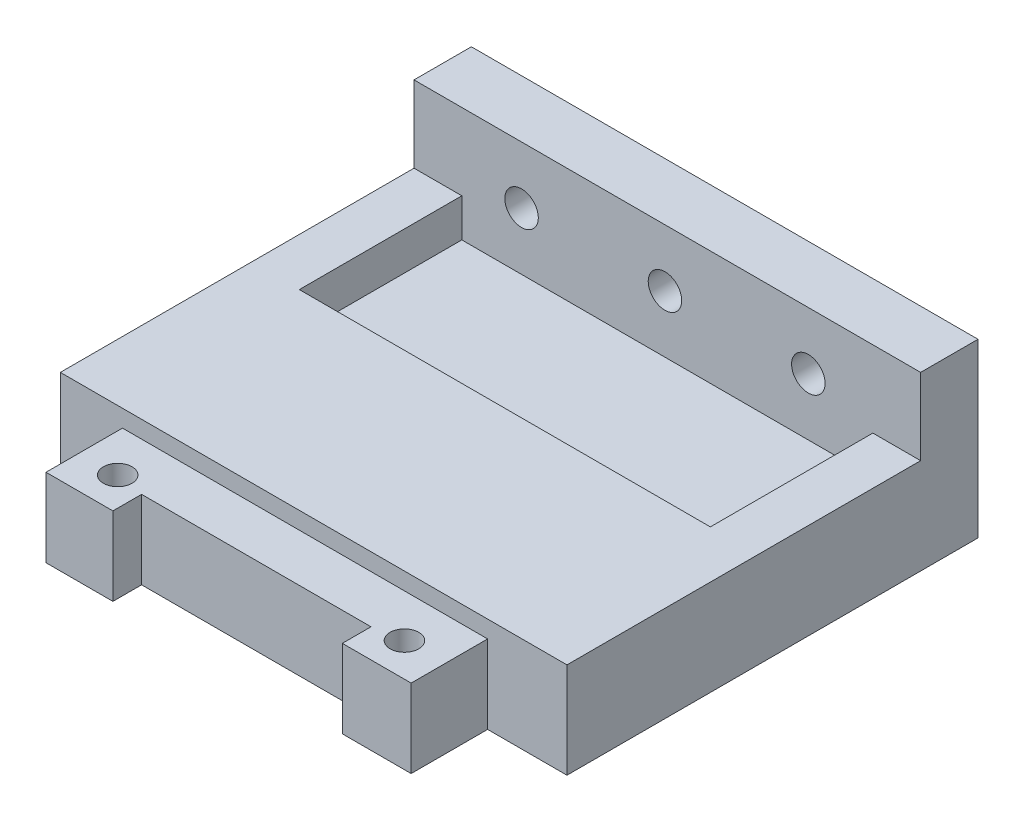
ISO-10303-21;
HEADER;
FILE_DESCRIPTION(('STEP AP214'),'2;1');
FILE_NAME('part.step','',(''),(''),'','','');
FILE_SCHEMA(('AUTOMOTIVE_DESIGN { 1 0 10303 214 1 1 1 1 }'));
ENDSEC;
DATA;
#1=APPLICATION_CONTEXT('core data for automotive mechanical design processes');
#2=APPLICATION_PROTOCOL_DEFINITION('international standard','automotive_design',2000,#1);
#3=PRODUCT_CONTEXT('',#1,'mechanical');
#4=PRODUCT('Part','Part','',(#3));
#5=PRODUCT_RELATED_PRODUCT_CATEGORY('part','',(#4));
#6=PRODUCT_DEFINITION_FORMATION('','',#4);
#7=PRODUCT_DEFINITION_CONTEXT('part definition',#1,'design');
#8=PRODUCT_DEFINITION('design','',#6,#7);
#9=PRODUCT_DEFINITION_SHAPE('','',#8);
#10=(LENGTH_UNIT() NAMED_UNIT(*) SI_UNIT(.MILLI.,.METRE.));
#11=(NAMED_UNIT(*) PLANE_ANGLE_UNIT() SI_UNIT($,.RADIAN.));
#12=(NAMED_UNIT(*) SI_UNIT($,.STERADIAN.) SOLID_ANGLE_UNIT());
#13=UNCERTAINTY_MEASURE_WITH_UNIT(LENGTH_MEASURE(1.E-05),#10,'distance_accuracy_value','');
#14=(GEOMETRIC_REPRESENTATION_CONTEXT(3) GLOBAL_UNCERTAINTY_ASSIGNED_CONTEXT((#13)) GLOBAL_UNIT_ASSIGNED_CONTEXT((#10,
#11,#12)) REPRESENTATION_CONTEXT('',''));
#15=CARTESIAN_POINT('',(0.,0.,0.));
#16=DIRECTION('',(0.,0.,1.));
#17=DIRECTION('',(1.,0.,0.));
#18=AXIS2_PLACEMENT_3D('',#15,#16,#17);
#19=CARTESIAN_POINT('',(0.,10.,0.));
#20=DIRECTION('',(0.,-1.,0.));
#21=DIRECTION('',(0.,0.,-1.));
#22=AXIS2_PLACEMENT_3D('',#19,#20,#21);
#23=PLANE('',#22);
#24=DIRECTION('',(1.,0.,0.));
#25=VECTOR('',#24,1.);
#26=CARTESIAN_POINT('',(5.,10.,-20.));
#27=LINE('',#26,#25);
#28=CARTESIAN_POINT('',(5.,10.,-20.));
#29=VERTEX_POINT('',#28);
#30=CARTESIAN_POINT('',(48.,10.,-20.));
#31=VERTEX_POINT('',#30);
#32=EDGE_CURVE('E186',#29,#31,#27,.T.);
#33=ORIENTED_EDGE('',*,*,#32,.F.);
#34=DIRECTION('',(0.,0.,1.));
#35=VECTOR('',#34,1.);
#36=CARTESIAN_POINT('',(5.,10.,-37.));
#37=LINE('',#36,#35);
#38=CARTESIAN_POINT('',(5.,10.,-37.));
#39=VERTEX_POINT('',#38);
#40=EDGE_CURVE('E168',#39,#29,#37,.T.);
#41=ORIENTED_EDGE('',*,*,#40,.F.);
#42=DIRECTION('',(1.,0.,0.));
#43=VECTOR('',#42,1.);
#44=CARTESIAN_POINT('',(0.,10.,-37.));
#45=LINE('',#44,#43);
#46=CARTESIAN_POINT('',(0.,10.,-37.));
#47=VERTEX_POINT('',#46);
#48=EDGE_CURVE('E59',#47,#39,#45,.T.);
#49=ORIENTED_EDGE('',*,*,#48,.F.);
#50=DIRECTION('',(0.,0.,1.));
#51=VECTOR('',#50,1.);
#52=CARTESIAN_POINT('',(0.,10.,0.));
#53=LINE('',#52,#51);
#54=CARTESIAN_POINT('',(0.,10.,0.));
#55=VERTEX_POINT('',#54);
#56=EDGE_CURVE('E333',#47,#55,#53,.T.);
#57=ORIENTED_EDGE('',*,*,#56,.T.);
#58=DIRECTION('',(1.,0.,0.));
#59=VECTOR('',#58,1.);
#60=CARTESIAN_POINT('',(0.,10.,0.));
#61=LINE('',#60,#59);
#62=CARTESIAN_POINT('',(53.,10.,0.));
#63=VERTEX_POINT('',#62);
#64=EDGE_CURVE('E332',#55,#63,#61,.T.);
#65=ORIENTED_EDGE('',*,*,#64,.T.);
#66=DIRECTION('',(0.,0.,-1.));
#67=VECTOR('',#66,1.);
#68=CARTESIAN_POINT('',(53.,10.,0.));
#69=LINE('',#68,#67);
#70=CARTESIAN_POINT('',(53.,10.,-37.));
#71=VERTEX_POINT('',#70);
#72=EDGE_CURVE('E229',#63,#71,#69,.T.);
#73=ORIENTED_EDGE('',*,*,#72,.T.);
#74=CARTESIAN_POINT('',(48.,10.,-37.));
#75=VERTEX_POINT('',#74);
#76=EDGE_CURVE('E37',#75,#71,#45,.T.);
#77=ORIENTED_EDGE('',*,*,#76,.F.);
#78=DIRECTION('',(0.,0.,-1.));
#79=VECTOR('',#78,1.);
#80=CARTESIAN_POINT('',(48.,10.,-37.));
#81=LINE('',#80,#79);
#82=EDGE_CURVE('E51',#31,#75,#81,.T.);
#83=ORIENTED_EDGE('',*,*,#82,.F.);
#84=EDGE_LOOP('',(#33,#41,#49,#57,#65,#73,#77,#83));
#85=FACE_BOUND('',#84,.T.);
#86=ADVANCED_FACE('F33',(#85),#23,.F.);
#87=CARTESIAN_POINT('',(0.,0.,8.));
#88=DIRECTION('',(0.,0.,-1.));
#89=DIRECTION('',(-1.,0.,0.));
#90=AXIS2_PLACEMENT_3D('',#87,#88,#89);
#91=PLANE('',#90);
#92=DIRECTION('',(0.,-1.,0.));
#93=VECTOR('',#92,1.);
#94=CARTESIAN_POINT('',(37.499019149862,8.2,8.));
#95=LINE('',#94,#93);
#96=CARTESIAN_POINT('',(37.499019149862,8.2,8.));
#97=VERTEX_POINT('',#96);
#98=CARTESIAN_POINT('',(37.499019149862,0.,8.));
#99=VERTEX_POINT('',#98);
#100=EDGE_CURVE('E357',#97,#99,#95,.T.);
#101=ORIENTED_EDGE('',*,*,#100,.T.);
#102=DIRECTION('',(1.,0.,0.));
#103=VECTOR('',#102,1.);
#104=CARTESIAN_POINT('',(6.49901914986197,0.,8.));
#105=LINE('',#104,#103);
#106=CARTESIAN_POINT('',(44.699019149862,0.,8.));
#107=VERTEX_POINT('',#106);
#108=EDGE_CURVE('E345',#99,#107,#105,.T.);
#109=ORIENTED_EDGE('',*,*,#108,.T.);
#110=DIRECTION('',(0.,1.,0.));
#111=VECTOR('',#110,1.);
#112=CARTESIAN_POINT('',(44.699019149862,0.,8.));
#113=LINE('',#112,#111);
#114=CARTESIAN_POINT('',(44.699019149862,8.2,8.));
#115=VERTEX_POINT('',#114);
#116=EDGE_CURVE('E340',#107,#115,#113,.T.);
#117=ORIENTED_EDGE('',*,*,#116,.T.);
#118=DIRECTION('',(-1.,0.,0.));
#119=VECTOR('',#118,1.);
#120=CARTESIAN_POINT('',(6.49901914986197,8.2,8.));
#121=LINE('',#120,#119);
#122=EDGE_CURVE('E321',#115,#97,#121,.T.);
#123=ORIENTED_EDGE('',*,*,#122,.T.);
#124=EDGE_LOOP('',(#101,#109,#117,#123));
#125=FACE_BOUND('',#124,.T.);
#126=ADVANCED_FACE('F265',(#125),#91,.F.);
#127=CARTESIAN_POINT('',(0.,10.,0.));
#128=DIRECTION('',(0.,0.,-1.));
#129=DIRECTION('',(-1.,0.,0.));
#130=AXIS2_PLACEMENT_3D('',#127,#128,#129);
#131=PLANE('',#130);
#132=DIRECTION('',(0.,-1.,0.));
#133=VECTOR('',#132,1.);
#134=CARTESIAN_POINT('',(6.49901914986197,0.,0.));
#135=LINE('',#134,#133);
#136=CARTESIAN_POINT('',(6.49901914986197,8.2,0.));
#137=VERTEX_POINT('',#136);
#138=CARTESIAN_POINT('',(6.49901914986197,0.,0.));
#139=VERTEX_POINT('',#138);
#140=EDGE_CURVE('E296',#137,#139,#135,.T.);
#141=ORIENTED_EDGE('',*,*,#140,.F.);
#142=DIRECTION('',(-1.,0.,0.));
#143=VECTOR('',#142,1.);
#144=CARTESIAN_POINT('',(6.49901914986197,8.2,0.));
#145=LINE('',#144,#143);
#146=CARTESIAN_POINT('',(44.699019149862,8.2,0.));
#147=VERTEX_POINT('',#146);
#148=EDGE_CURVE('E298',#147,#137,#145,.T.);
#149=ORIENTED_EDGE('',*,*,#148,.F.);
#150=DIRECTION('',(0.,1.,0.));
#151=VECTOR('',#150,1.);
#152=CARTESIAN_POINT('',(44.699019149862,0.,0.));
#153=LINE('',#152,#151);
#154=CARTESIAN_POINT('',(44.699019149862,0.,0.));
#155=VERTEX_POINT('',#154);
#156=EDGE_CURVE('E305',#155,#147,#153,.T.);
#157=ORIENTED_EDGE('',*,*,#156,.F.);
#158=DIRECTION('',(1.,0.,0.));
#159=VECTOR('',#158,1.);
#160=CARTESIAN_POINT('',(0.,0.,0.));
#161=LINE('',#160,#159);
#162=CARTESIAN_POINT('',(53.,0.,0.));
#163=VERTEX_POINT('',#162);
#164=EDGE_CURVE('E427',#155,#163,#161,.T.);
#165=ORIENTED_EDGE('',*,*,#164,.T.);
#166=DIRECTION('',(0.,-1.,0.));
#167=VECTOR('',#166,1.);
#168=CARTESIAN_POINT('',(53.,10.,0.));
#169=LINE('',#168,#167);
#170=EDGE_CURVE('E43',#63,#163,#169,.T.);
#171=ORIENTED_EDGE('',*,*,#170,.F.);
#172=ORIENTED_EDGE('',*,*,#64,.F.);
#173=DIRECTION('',(0.,-1.,0.));
#174=VECTOR('',#173,1.);
#175=CARTESIAN_POINT('',(0.,10.,0.));
#176=LINE('',#175,#174);
#177=CARTESIAN_POINT('',(0.,0.,0.));
#178=VERTEX_POINT('',#177);
#179=EDGE_CURVE('E11',#55,#178,#176,.T.);
#180=ORIENTED_EDGE('',*,*,#179,.T.);
#181=EDGE_CURVE('E300',#178,#139,#161,.T.);
#182=ORIENTED_EDGE('',*,*,#181,.T.);
#183=EDGE_LOOP('',(#141,#149,#157,#165,#171,#172,#180,#182));
#184=FACE_BOUND('',#183,.T.);
#185=ADVANCED_FACE('F270',(#184),#131,.F.);
#186=CARTESIAN_POINT('',(0.,10.,0.));
#187=DIRECTION('',(1.,0.,0.));
#188=DIRECTION('',(0.,0.,-1.));
#189=AXIS2_PLACEMENT_3D('',#186,#187,#188);
#190=PLANE('',#189);
#191=DIRECTION('',(0.,0.,1.));
#192=VECTOR('',#191,1.);
#193=CARTESIAN_POINT('',(0.,0.,0.));
#194=LINE('',#193,#192);
#195=CARTESIAN_POINT('',(0.,0.,-43.));
#196=VERTEX_POINT('',#195);
#197=EDGE_CURVE('E435',#196,#178,#194,.T.);
#198=ORIENTED_EDGE('',*,*,#197,.T.);
#199=ORIENTED_EDGE('',*,*,#179,.F.);
#200=ORIENTED_EDGE('',*,*,#56,.F.);
#201=DIRECTION('',(0.,-1.,0.));
#202=VECTOR('',#201,1.);
#203=CARTESIAN_POINT('',(0.,18.,-37.));
#204=LINE('',#203,#202);
#205=CARTESIAN_POINT('',(0.,18.,-37.));
#206=VERTEX_POINT('',#205);
#207=EDGE_CURVE('E234',#206,#47,#204,.T.);
#208=ORIENTED_EDGE('',*,*,#207,.F.);
#209=DIRECTION('',(0.,0.,1.));
#210=VECTOR('',#209,1.);
#211=CARTESIAN_POINT('',(0.,18.,-43.));
#212=LINE('',#211,#210);
#213=CARTESIAN_POINT('',(0.,18.,-43.));
#214=VERTEX_POINT('',#213);
#215=EDGE_CURVE('E210',#214,#206,#212,.T.);
#216=ORIENTED_EDGE('',*,*,#215,.F.);
#217=DIRECTION('',(0.,-1.,0.));
#218=VECTOR('',#217,1.);
#219=CARTESIAN_POINT('',(0.,10.,-43.));
#220=LINE('',#219,#218);
#221=EDGE_CURVE('E454',#214,#196,#220,.T.);
#222=ORIENTED_EDGE('',*,*,#221,.T.);
#223=EDGE_LOOP('',(#198,#199,#200,#208,#216,#222));
#224=FACE_BOUND('',#223,.T.);
#225=ADVANCED_FACE('F35',(#224),#190,.F.);
#226=CARTESIAN_POINT('',(53.,10.,0.));
#227=DIRECTION('',(-1.,0.,0.));
#228=DIRECTION('',(0.,0.,1.));
#229=AXIS2_PLACEMENT_3D('',#226,#227,#228);
#230=PLANE('',#229);
#231=DIRECTION('',(0.,0.,-1.));
#232=VECTOR('',#231,1.);
#233=CARTESIAN_POINT('',(53.,0.,0.));
#234=LINE('',#233,#232);
#235=CARTESIAN_POINT('',(53.,0.,-43.));
#236=VERTEX_POINT('',#235);
#237=EDGE_CURVE('E445',#163,#236,#234,.T.);
#238=ORIENTED_EDGE('',*,*,#237,.T.);
#239=DIRECTION('',(0.,-1.,0.));
#240=VECTOR('',#239,1.);
#241=CARTESIAN_POINT('',(53.,10.,-43.));
#242=LINE('',#241,#240);
#243=CARTESIAN_POINT('',(53.,18.,-43.));
#244=VERTEX_POINT('',#243);
#245=EDGE_CURVE('E451',#244,#236,#242,.T.);
#246=ORIENTED_EDGE('',*,*,#245,.F.);
#247=DIRECTION('',(0.,0.,-1.));
#248=VECTOR('',#247,1.);
#249=CARTESIAN_POINT('',(53.,18.,-43.));
#250=LINE('',#249,#248);
#251=CARTESIAN_POINT('',(53.,18.,-37.));
#252=VERTEX_POINT('',#251);
#253=EDGE_CURVE('E215',#252,#244,#250,.T.);
#254=ORIENTED_EDGE('',*,*,#253,.F.);
#255=DIRECTION('',(0.,-1.,0.));
#256=VECTOR('',#255,1.);
#257=CARTESIAN_POINT('',(53.,18.,-37.));
#258=LINE('',#257,#256);
#259=EDGE_CURVE('E220',#252,#71,#258,.T.);
#260=ORIENTED_EDGE('',*,*,#259,.T.);
#261=ORIENTED_EDGE('',*,*,#72,.F.);
#262=ORIENTED_EDGE('',*,*,#170,.T.);
#263=EDGE_LOOP('',(#238,#246,#254,#260,#261,#262));
#264=FACE_BOUND('',#263,.T.);
#265=ADVANCED_FACE('F285',(#264),#230,.F.);
#266=CARTESIAN_POINT('',(0.,10.,-43.));
#267=DIRECTION('',(0.,0.,1.));
#268=DIRECTION('',(1.,0.,0.));
#269=AXIS2_PLACEMENT_3D('',#266,#267,#268);
#270=PLANE('',#269);
#271=CARTESIAN_POINT('',(11.25,12.,-43.));
#272=DIRECTION('',(0.,0.,-1.));
#273=DIRECTION('',(-1.,0.,0.));
#274=AXIS2_PLACEMENT_3D('',#271,#272,#273);
#275=CIRCLE('',#274,1.75);
#276=CARTESIAN_POINT('',(9.5,12.,-43.));
#277=VERTEX_POINT('',#276);
#278=EDGE_CURVE('E195',#277,#277,#275,.T.);
#279=ORIENTED_EDGE('',*,*,#278,.F.);
#280=EDGE_LOOP('',(#279));
#281=FACE_BOUND('',#280,.T.);
#282=CARTESIAN_POINT('',(26.25,12.,-43.));
#283=DIRECTION('',(0.,0.,-1.));
#284=DIRECTION('',(-1.,0.,0.));
#285=AXIS2_PLACEMENT_3D('',#282,#283,#284);
#286=CIRCLE('',#285,1.75);
#287=CARTESIAN_POINT('',(24.5,12.,-43.));
#288=VERTEX_POINT('',#287);
#289=EDGE_CURVE('E202',#288,#288,#286,.T.);
#290=ORIENTED_EDGE('',*,*,#289,.F.);
#291=EDGE_LOOP('',(#290));
#292=FACE_BOUND('',#291,.T.);
#293=CARTESIAN_POINT('',(41.25,12.,-43.));
#294=DIRECTION('',(0.,0.,-1.));
#295=DIRECTION('',(-1.,0.,0.));
#296=AXIS2_PLACEMENT_3D('',#293,#294,#295);
#297=CIRCLE('',#296,1.75);
#298=CARTESIAN_POINT('',(39.5,12.,-43.));
#299=VERTEX_POINT('',#298);
#300=EDGE_CURVE('E206',#299,#299,#297,.T.);
#301=ORIENTED_EDGE('',*,*,#300,.F.);
#302=EDGE_LOOP('',(#301));
#303=FACE_BOUND('',#302,.T.);
#304=DIRECTION('',(-1.,0.,0.));
#305=VECTOR('',#304,1.);
#306=CARTESIAN_POINT('',(0.,0.,-43.));
#307=LINE('',#306,#305);
#308=EDGE_CURVE('E334',#236,#196,#307,.T.);
#309=ORIENTED_EDGE('',*,*,#308,.T.);
#310=ORIENTED_EDGE('',*,*,#221,.F.);
#311=DIRECTION('',(-1.,0.,0.));
#312=VECTOR('',#311,1.);
#313=CARTESIAN_POINT('',(0.,18.,-43.));
#314=LINE('',#313,#312);
#315=EDGE_CURVE('E218',#244,#214,#314,.T.);
#316=ORIENTED_EDGE('',*,*,#315,.F.);
#317=ORIENTED_EDGE('',*,*,#245,.T.);
#318=EDGE_LOOP('',(#309,#310,#316,#317));
#319=FACE_BOUND('',#318,.T.);
#320=ADVANCED_FACE('F281',(#281,#292,#303,#319),#270,.F.);
#321=CARTESIAN_POINT('',(0.,0.,0.));
#322=DIRECTION('',(0.,-1.,0.));
#323=DIRECTION('',(0.,0.,-1.));
#324=AXIS2_PLACEMENT_3D('',#321,#322,#323);
#325=PLANE('',#324);
#326=CARTESIAN_POINT('',(10.499019149862,0.,4.5));
#327=DIRECTION('',(0.,-1.,0.));
#328=DIRECTION('',(0.,0.,-1.));
#329=AXIS2_PLACEMENT_3D('',#326,#327,#328);
#330=CIRCLE('',#329,1.5);
#331=CARTESIAN_POINT('',(10.499019149862,0.,3.));
#332=VERTEX_POINT('',#331);
#333=EDGE_CURVE('E377',#332,#332,#330,.T.);
#334=ORIENTED_EDGE('',*,*,#333,.F.);
#335=EDGE_LOOP('',(#334));
#336=FACE_BOUND('',#335,.T.);
#337=CARTESIAN_POINT('',(40.499019149862,0.,4.5));
#338=DIRECTION('',(0.,-1.,0.));
#339=DIRECTION('',(0.,0.,-1.));
#340=AXIS2_PLACEMENT_3D('',#337,#338,#339);
#341=CIRCLE('',#340,1.5);
#342=CARTESIAN_POINT('',(40.499019149862,0.,3.));
#343=VERTEX_POINT('',#342);
#344=EDGE_CURVE('E363',#343,#343,#341,.T.);
#345=ORIENTED_EDGE('',*,*,#344,.F.);
#346=EDGE_LOOP('',(#345));
#347=FACE_BOUND('',#346,.T.);
#348=DIRECTION('',(0.,0.,1.));
#349=VECTOR('',#348,1.);
#350=CARTESIAN_POINT('',(13.499019149862,0.,5.));
#351=LINE('',#350,#349);
#352=CARTESIAN_POINT('',(13.499019149862,0.,5.));
#353=VERTEX_POINT('',#352);
#354=CARTESIAN_POINT('',(13.499019149862,0.,8.));
#355=VERTEX_POINT('',#354);
#356=EDGE_CURVE('E347',#353,#355,#351,.T.);
#357=ORIENTED_EDGE('',*,*,#356,.T.);
#358=CARTESIAN_POINT('',(6.49901914986197,0.,8.));
#359=VERTEX_POINT('',#358);
#360=EDGE_CURVE('E342',#359,#355,#105,.T.);
#361=ORIENTED_EDGE('',*,*,#360,.F.);
#362=DIRECTION('',(0.,0.,-1.));
#363=VECTOR('',#362,1.);
#364=CARTESIAN_POINT('',(6.49901914986197,0.,8.));
#365=LINE('',#364,#363);
#366=EDGE_CURVE('E433',#359,#139,#365,.T.);
#367=ORIENTED_EDGE('',*,*,#366,.T.);
#368=ORIENTED_EDGE('',*,*,#181,.F.);
#369=ORIENTED_EDGE('',*,*,#197,.F.);
#370=ORIENTED_EDGE('',*,*,#308,.F.);
#371=ORIENTED_EDGE('',*,*,#237,.F.);
#372=ORIENTED_EDGE('',*,*,#164,.F.);
#373=DIRECTION('',(0.,0.,-1.));
#374=VECTOR('',#373,1.);
#375=CARTESIAN_POINT('',(44.699019149862,0.,8.));
#376=LINE('',#375,#374);
#377=EDGE_CURVE('E323',#107,#155,#376,.T.);
#378=ORIENTED_EDGE('',*,*,#377,.F.);
#379=ORIENTED_EDGE('',*,*,#108,.F.);
#380=DIRECTION('',(0.,0.,1.));
#381=VECTOR('',#380,1.);
#382=CARTESIAN_POINT('',(37.499019149862,0.,5.));
#383=LINE('',#382,#381);
#384=CARTESIAN_POINT('',(37.499019149862,0.,5.));
#385=VERTEX_POINT('',#384);
#386=EDGE_CURVE('E350',#385,#99,#383,.T.);
#387=ORIENTED_EDGE('',*,*,#386,.F.);
#388=DIRECTION('',(1.,0.,0.));
#389=VECTOR('',#388,1.);
#390=CARTESIAN_POINT('',(13.499019149862,0.,5.));
#391=LINE('',#390,#389);
#392=EDGE_CURVE('E368',#353,#385,#391,.T.);
#393=ORIENTED_EDGE('',*,*,#392,.F.);
#394=EDGE_LOOP('',(#357,#361,#367,#368,#369,#370,#371,#372,#378,#379,#387,#393));
#395=FACE_BOUND('',#394,.T.);
#396=ADVANCED_FACE('F278',(#336,#347,#395),#325,.T.);
#397=CARTESIAN_POINT('',(6.49901914986197,0.,8.));
#398=DIRECTION('',(1.,0.,0.));
#399=DIRECTION('',(0.,0.,-1.));
#400=AXIS2_PLACEMENT_3D('',#397,#398,#399);
#401=PLANE('',#400);
#402=ORIENTED_EDGE('',*,*,#140,.T.);
#403=ORIENTED_EDGE('',*,*,#366,.F.);
#404=DIRECTION('',(0.,-1.,0.));
#405=VECTOR('',#404,1.);
#406=CARTESIAN_POINT('',(6.49901914986197,0.,8.));
#407=LINE('',#406,#405);
#408=CARTESIAN_POINT('',(6.49901914986197,8.2,8.));
#409=VERTEX_POINT('',#408);
#410=EDGE_CURVE('E318',#409,#359,#407,.T.);
#411=ORIENTED_EDGE('',*,*,#410,.F.);
#412=DIRECTION('',(0.,0.,-1.));
#413=VECTOR('',#412,1.);
#414=CARTESIAN_POINT('',(6.49901914986197,8.2,8.));
#415=LINE('',#414,#413);
#416=EDGE_CURVE('E313',#409,#137,#415,.T.);
#417=ORIENTED_EDGE('',*,*,#416,.T.);
#418=EDGE_LOOP('',(#402,#403,#411,#417));
#419=FACE_BOUND('',#418,.T.);
#420=ADVANCED_FACE('F276',(#419),#401,.F.);
#421=CARTESIAN_POINT('',(44.699019149862,0.,8.));
#422=DIRECTION('',(-1.,0.,0.));
#423=DIRECTION('',(0.,0.,1.));
#424=AXIS2_PLACEMENT_3D('',#421,#422,#423);
#425=PLANE('',#424);
#426=ORIENTED_EDGE('',*,*,#156,.T.);
#427=DIRECTION('',(0.,0.,-1.));
#428=VECTOR('',#427,1.);
#429=CARTESIAN_POINT('',(44.699019149862,8.2,8.));
#430=LINE('',#429,#428);
#431=EDGE_CURVE('E317',#115,#147,#430,.T.);
#432=ORIENTED_EDGE('',*,*,#431,.F.);
#433=ORIENTED_EDGE('',*,*,#116,.F.);
#434=ORIENTED_EDGE('',*,*,#377,.T.);
#435=EDGE_LOOP('',(#426,#432,#433,#434));
#436=FACE_BOUND('',#435,.T.);
#437=ADVANCED_FACE('F388',(#436),#425,.F.);
#438=CARTESIAN_POINT('',(6.49901914986197,8.2,8.));
#439=DIRECTION('',(0.,-1.,0.));
#440=DIRECTION('',(0.,0.,-1.));
#441=AXIS2_PLACEMENT_3D('',#438,#439,#440);
#442=PLANE('',#441);
#443=CARTESIAN_POINT('',(10.499019149862,8.2,4.5));
#444=DIRECTION('',(0.,1.,0.));
#445=DIRECTION('',(0.,0.,1.));
#446=AXIS2_PLACEMENT_3D('',#443,#444,#445);
#447=CIRCLE('',#446,1.5);
#448=CARTESIAN_POINT('',(10.499019149862,8.2,6.));
#449=VERTEX_POINT('',#448);
#450=EDGE_CURVE('E223',#449,#449,#447,.T.);
#451=ORIENTED_EDGE('',*,*,#450,.F.);
#452=EDGE_LOOP('',(#451));
#453=FACE_BOUND('',#452,.T.);
#454=CARTESIAN_POINT('',(40.499019149862,8.2,4.5));
#455=DIRECTION('',(0.,1.,0.));
#456=DIRECTION('',(0.,0.,1.));
#457=AXIS2_PLACEMENT_3D('',#454,#455,#456);
#458=CIRCLE('',#457,1.5);
#459=CARTESIAN_POINT('',(40.499019149862,8.2,6.));
#460=VERTEX_POINT('',#459);
#461=EDGE_CURVE('E375',#460,#460,#458,.T.);
#462=ORIENTED_EDGE('',*,*,#461,.F.);
#463=EDGE_LOOP('',(#462));
#464=FACE_BOUND('',#463,.T.);
#465=CARTESIAN_POINT('',(13.499019149862,8.2,8.));
#466=VERTEX_POINT('',#465);
#467=EDGE_CURVE('E326',#466,#409,#121,.T.);
#468=ORIENTED_EDGE('',*,*,#467,.F.);
#469=DIRECTION('',(0.,0.,1.));
#470=VECTOR('',#469,1.);
#471=CARTESIAN_POINT('',(13.499019149862,8.2,5.));
#472=LINE('',#471,#470);
#473=CARTESIAN_POINT('',(13.499019149862,8.2,5.));
#474=VERTEX_POINT('',#473);
#475=EDGE_CURVE('E306',#474,#466,#472,.T.);
#476=ORIENTED_EDGE('',*,*,#475,.F.);
#477=DIRECTION('',(1.,0.,0.));
#478=VECTOR('',#477,1.);
#479=CARTESIAN_POINT('',(13.499019149862,8.2,5.));
#480=LINE('',#479,#478);
#481=CARTESIAN_POINT('',(37.499019149862,8.2,5.));
#482=VERTEX_POINT('',#481);
#483=EDGE_CURVE('E351',#474,#482,#480,.T.);
#484=ORIENTED_EDGE('',*,*,#483,.T.);
#485=DIRECTION('',(0.,0.,1.));
#486=VECTOR('',#485,1.);
#487=CARTESIAN_POINT('',(37.499019149862,8.2,5.));
#488=LINE('',#487,#486);
#489=EDGE_CURVE('E353',#482,#97,#488,.T.);
#490=ORIENTED_EDGE('',*,*,#489,.T.);
#491=ORIENTED_EDGE('',*,*,#122,.F.);
#492=ORIENTED_EDGE('',*,*,#431,.T.);
#493=ORIENTED_EDGE('',*,*,#148,.T.);
#494=ORIENTED_EDGE('',*,*,#416,.F.);
#495=EDGE_LOOP('',(#468,#476,#484,#490,#491,#492,#493,#494));
#496=FACE_BOUND('',#495,.T.);
#497=ADVANCED_FACE('F312',(#453,#464,#496),#442,.F.);
#498=ORIENTED_EDGE('',*,*,#360,.T.);
#499=DIRECTION('',(0.,-1.,0.));
#500=VECTOR('',#499,1.);
#501=CARTESIAN_POINT('',(13.499019149862,8.2,8.));
#502=LINE('',#501,#500);
#503=EDGE_CURVE('E361',#466,#355,#502,.T.);
#504=ORIENTED_EDGE('',*,*,#503,.F.);
#505=ORIENTED_EDGE('',*,*,#467,.T.);
#506=ORIENTED_EDGE('',*,*,#410,.T.);
#507=EDGE_LOOP('',(#498,#504,#505,#506));
#508=FACE_BOUND('',#507,.T.);
#509=ADVANCED_FACE('F273',(#508),#91,.F.);
#510=CARTESIAN_POINT('',(13.499019149862,8.2,5.));
#511=DIRECTION('',(-1.,0.,0.));
#512=DIRECTION('',(0.,-1.,0.));
#513=AXIS2_PLACEMENT_3D('',#510,#511,#512);
#514=PLANE('',#513);
#515=ORIENTED_EDGE('',*,*,#503,.T.);
#516=ORIENTED_EDGE('',*,*,#356,.F.);
#517=DIRECTION('',(0.,-1.,0.));
#518=VECTOR('',#517,1.);
#519=CARTESIAN_POINT('',(13.499019149862,8.2,5.));
#520=LINE('',#519,#518);
#521=EDGE_CURVE('E360',#474,#353,#520,.T.);
#522=ORIENTED_EDGE('',*,*,#521,.F.);
#523=ORIENTED_EDGE('',*,*,#475,.T.);
#524=EDGE_LOOP('',(#515,#516,#522,#523));
#525=FACE_BOUND('',#524,.T.);
#526=ADVANCED_FACE('F409',(#525),#514,.F.);
#527=CARTESIAN_POINT('',(37.499019149862,8.2,5.));
#528=DIRECTION('',(-1.,0.,0.));
#529=DIRECTION('',(0.,0.,1.));
#530=AXIS2_PLACEMENT_3D('',#527,#528,#529);
#531=PLANE('',#530);
#532=ORIENTED_EDGE('',*,*,#100,.F.);
#533=ORIENTED_EDGE('',*,*,#489,.F.);
#534=DIRECTION('',(0.,-1.,0.));
#535=VECTOR('',#534,1.);
#536=CARTESIAN_POINT('',(37.499019149862,8.2,5.));
#537=LINE('',#536,#535);
#538=EDGE_CURVE('E366',#482,#385,#537,.T.);
#539=ORIENTED_EDGE('',*,*,#538,.T.);
#540=ORIENTED_EDGE('',*,*,#386,.T.);
#541=EDGE_LOOP('',(#532,#533,#539,#540));
#542=FACE_BOUND('',#541,.T.);
#543=ADVANCED_FACE('F402',(#542),#531,.T.);
#544=CARTESIAN_POINT('',(0.,0.,5.));
#545=DIRECTION('',(0.,0.,1.));
#546=DIRECTION('',(1.,0.,0.));
#547=AXIS2_PLACEMENT_3D('',#544,#545,#546);
#548=PLANE('',#547);
#549=ORIENTED_EDGE('',*,*,#521,.T.);
#550=ORIENTED_EDGE('',*,*,#392,.T.);
#551=ORIENTED_EDGE('',*,*,#538,.F.);
#552=ORIENTED_EDGE('',*,*,#483,.F.);
#553=EDGE_LOOP('',(#549,#550,#551,#552));
#554=FACE_BOUND('',#553,.T.);
#555=ADVANCED_FACE('F394',(#554),#548,.T.);
#556=CARTESIAN_POINT('',(40.499019149862,-4.99999999997031E-05,4.5));
#557=DIRECTION('',(0.,1.,0.));
#558=DIRECTION('',(0.,0.,1.));
#559=AXIS2_PLACEMENT_3D('',#556,#557,#558);
#560=CYLINDRICAL_SURFACE('',#559,1.5);
#561=ORIENTED_EDGE('',*,*,#344,.T.);
#562=EDGE_LOOP('',(#561));
#563=FACE_BOUND('',#562,.T.);
#564=ORIENTED_EDGE('',*,*,#461,.T.);
#565=EDGE_LOOP('',(#564));
#566=FACE_BOUND('',#565,.T.);
#567=ADVANCED_FACE('F392',(#563,#566),#560,.F.);
#568=CARTESIAN_POINT('',(10.499019149862,-4.99999999997031E-05,4.5));
#569=DIRECTION('',(0.,1.,0.));
#570=DIRECTION('',(0.,0.,1.));
#571=AXIS2_PLACEMENT_3D('',#568,#569,#570);
#572=CYLINDRICAL_SURFACE('',#571,1.5);
#573=ORIENTED_EDGE('',*,*,#333,.T.);
#574=EDGE_LOOP('',(#573));
#575=FACE_BOUND('',#574,.T.);
#576=ORIENTED_EDGE('',*,*,#450,.T.);
#577=EDGE_LOOP('',(#576));
#578=FACE_BOUND('',#577,.T.);
#579=ADVANCED_FACE('F384',(#575,#578),#572,.F.);
#580=CARTESIAN_POINT('',(0.,18.,-37.));
#581=DIRECTION('',(0.,0.,-1.));
#582=DIRECTION('',(-1.,0.,0.));
#583=AXIS2_PLACEMENT_3D('',#580,#581,#582);
#584=PLANE('',#583);
#585=CARTESIAN_POINT('',(11.25,12.,-37.));
#586=DIRECTION('',(0.,0.,-1.));
#587=DIRECTION('',(-1.,0.,0.));
#588=AXIS2_PLACEMENT_3D('',#585,#586,#587);
#589=CIRCLE('',#588,1.75);
#590=CARTESIAN_POINT('',(9.5,12.,-37.));
#591=VERTEX_POINT('',#590);
#592=EDGE_CURVE('E201',#591,#591,#589,.T.);
#593=ORIENTED_EDGE('',*,*,#592,.T.);
#594=EDGE_LOOP('',(#593));
#595=FACE_BOUND('',#594,.T.);
#596=CARTESIAN_POINT('',(26.25,12.,-37.));
#597=DIRECTION('',(0.,0.,-1.));
#598=DIRECTION('',(-1.,0.,0.));
#599=AXIS2_PLACEMENT_3D('',#596,#597,#598);
#600=CIRCLE('',#599,1.75);
#601=CARTESIAN_POINT('',(24.5,12.,-37.));
#602=VERTEX_POINT('',#601);
#603=EDGE_CURVE('E205',#602,#602,#600,.T.);
#604=ORIENTED_EDGE('',*,*,#603,.T.);
#605=EDGE_LOOP('',(#604));
#606=FACE_BOUND('',#605,.T.);
#607=CARTESIAN_POINT('',(41.25,12.,-37.));
#608=DIRECTION('',(0.,0.,-1.));
#609=DIRECTION('',(-1.,0.,0.));
#610=AXIS2_PLACEMENT_3D('',#607,#608,#609);
#611=CIRCLE('',#610,1.75);
#612=CARTESIAN_POINT('',(39.5,12.,-37.));
#613=VERTEX_POINT('',#612);
#614=EDGE_CURVE('E209',#613,#613,#611,.T.);
#615=ORIENTED_EDGE('',*,*,#614,.T.);
#616=EDGE_LOOP('',(#615));
#617=FACE_BOUND('',#616,.T.);
#618=ORIENTED_EDGE('',*,*,#48,.T.);
#619=DIRECTION('',(0.,1.,0.));
#620=VECTOR('',#619,1.);
#621=CARTESIAN_POINT('',(5.,6.,-37.));
#622=LINE('',#621,#620);
#623=CARTESIAN_POINT('',(5.,6.,-37.));
#624=VERTEX_POINT('',#623);
#625=EDGE_CURVE('E193',#624,#39,#622,.T.);
#626=ORIENTED_EDGE('',*,*,#625,.F.);
#627=DIRECTION('',(-1.,0.,0.));
#628=VECTOR('',#627,1.);
#629=CARTESIAN_POINT('',(5.,6.,-37.));
#630=LINE('',#629,#628);
#631=CARTESIAN_POINT('',(48.,6.,-37.));
#632=VERTEX_POINT('',#631);
#633=EDGE_CURVE('E173',#632,#624,#630,.T.);
#634=ORIENTED_EDGE('',*,*,#633,.F.);
#635=DIRECTION('',(0.,1.,0.));
#636=VECTOR('',#635,1.);
#637=CARTESIAN_POINT('',(48.,6.,-37.));
#638=LINE('',#637,#636);
#639=EDGE_CURVE('E196',#632,#75,#638,.T.);
#640=ORIENTED_EDGE('',*,*,#639,.T.);
#641=ORIENTED_EDGE('',*,*,#76,.T.);
#642=ORIENTED_EDGE('',*,*,#259,.F.);
#643=DIRECTION('',(1.,0.,0.));
#644=VECTOR('',#643,1.);
#645=CARTESIAN_POINT('',(0.,18.,-37.));
#646=LINE('',#645,#644);
#647=EDGE_CURVE('E213',#206,#252,#646,.T.);
#648=ORIENTED_EDGE('',*,*,#647,.F.);
#649=ORIENTED_EDGE('',*,*,#207,.T.);
#650=EDGE_LOOP('',(#618,#626,#634,#640,#641,#642,#648,#649));
#651=FACE_BOUND('',#650,.T.);
#652=ADVANCED_FACE('F247',(#595,#606,#617,#651),#584,.F.);
#653=CARTESIAN_POINT('',(0.,18.,0.));
#654=DIRECTION('',(0.,1.,0.));
#655=DIRECTION('',(0.,0.,1.));
#656=AXIS2_PLACEMENT_3D('',#653,#654,#655);
#657=PLANE('',#656);
#658=ORIENTED_EDGE('',*,*,#215,.T.);
#659=ORIENTED_EDGE('',*,*,#647,.T.);
#660=ORIENTED_EDGE('',*,*,#253,.T.);
#661=ORIENTED_EDGE('',*,*,#315,.T.);
#662=EDGE_LOOP('',(#658,#659,#660,#661));
#663=FACE_BOUND('',#662,.T.);
#664=ADVANCED_FACE('F468',(#663),#657,.T.);
#665=CARTESIAN_POINT('',(41.25,12.,8.000025));
#666=DIRECTION('',(0.,0.,-1.));
#667=DIRECTION('',(-1.,0.,0.));
#668=AXIS2_PLACEMENT_3D('',#665,#666,#667);
#669=CYLINDRICAL_SURFACE('',#668,1.75);
#670=ORIENTED_EDGE('',*,*,#300,.T.);
#671=EDGE_LOOP('',(#670));
#672=FACE_BOUND('',#671,.T.);
#673=ORIENTED_EDGE('',*,*,#614,.F.);
#674=EDGE_LOOP('',(#673));
#675=FACE_BOUND('',#674,.T.);
#676=ADVANCED_FACE('F261',(#672,#675),#669,.F.);
#677=CARTESIAN_POINT('',(26.25,12.,8.000025));
#678=DIRECTION('',(0.,0.,-1.));
#679=DIRECTION('',(-1.,0.,0.));
#680=AXIS2_PLACEMENT_3D('',#677,#678,#679);
#681=CYLINDRICAL_SURFACE('',#680,1.75);
#682=ORIENTED_EDGE('',*,*,#289,.T.);
#683=EDGE_LOOP('',(#682));
#684=FACE_BOUND('',#683,.T.);
#685=ORIENTED_EDGE('',*,*,#603,.F.);
#686=EDGE_LOOP('',(#685));
#687=FACE_BOUND('',#686,.T.);
#688=ADVANCED_FACE('F252',(#684,#687),#681,.F.);
#689=CARTESIAN_POINT('',(11.25,12.,8.000025));
#690=DIRECTION('',(0.,0.,-1.));
#691=DIRECTION('',(-1.,0.,0.));
#692=AXIS2_PLACEMENT_3D('',#689,#690,#691);
#693=CYLINDRICAL_SURFACE('',#692,1.75);
#694=ORIENTED_EDGE('',*,*,#278,.T.);
#695=EDGE_LOOP('',(#694));
#696=FACE_BOUND('',#695,.T.);
#697=ORIENTED_EDGE('',*,*,#592,.F.);
#698=EDGE_LOOP('',(#697));
#699=FACE_BOUND('',#698,.T.);
#700=ADVANCED_FACE('F250',(#696,#699),#693,.F.);
#701=CARTESIAN_POINT('',(5.,6.,-37.));
#702=DIRECTION('',(-1.,0.,0.));
#703=DIRECTION('',(0.,0.,1.));
#704=AXIS2_PLACEMENT_3D('',#701,#702,#703);
#705=PLANE('',#704);
#706=ORIENTED_EDGE('',*,*,#40,.T.);
#707=DIRECTION('',(0.,1.,0.));
#708=VECTOR('',#707,1.);
#709=CARTESIAN_POINT('',(5.,6.,-20.));
#710=LINE('',#709,#708);
#711=CARTESIAN_POINT('',(5.,6.,-20.));
#712=VERTEX_POINT('',#711);
#713=EDGE_CURVE('E162',#712,#29,#710,.T.);
#714=ORIENTED_EDGE('',*,*,#713,.F.);
#715=DIRECTION('',(0.,0.,1.));
#716=VECTOR('',#715,1.);
#717=CARTESIAN_POINT('',(5.,6.,-37.));
#718=LINE('',#717,#716);
#719=EDGE_CURVE('E166',#624,#712,#718,.T.);
#720=ORIENTED_EDGE('',*,*,#719,.F.);
#721=ORIENTED_EDGE('',*,*,#625,.T.);
#722=EDGE_LOOP('',(#706,#714,#720,#721));
#723=FACE_BOUND('',#722,.T.);
#724=ADVANCED_FACE('F164',(#723),#705,.F.);
#725=CARTESIAN_POINT('',(48.,6.,-37.));
#726=DIRECTION('',(1.,0.,0.));
#727=DIRECTION('',(0.,0.,-1.));
#728=AXIS2_PLACEMENT_3D('',#725,#726,#727);
#729=PLANE('',#728);
#730=ORIENTED_EDGE('',*,*,#82,.T.);
#731=ORIENTED_EDGE('',*,*,#639,.F.);
#732=DIRECTION('',(0.,0.,-1.));
#733=VECTOR('',#732,1.);
#734=CARTESIAN_POINT('',(48.,6.,-37.));
#735=LINE('',#734,#733);
#736=CARTESIAN_POINT('',(48.,6.,-20.));
#737=VERTEX_POINT('',#736);
#738=EDGE_CURVE('E181',#737,#632,#735,.T.);
#739=ORIENTED_EDGE('',*,*,#738,.F.);
#740=DIRECTION('',(0.,1.,0.));
#741=VECTOR('',#740,1.);
#742=CARTESIAN_POINT('',(48.,6.,-20.));
#743=LINE('',#742,#741);
#744=EDGE_CURVE('E172',#737,#31,#743,.T.);
#745=ORIENTED_EDGE('',*,*,#744,.T.);
#746=EDGE_LOOP('',(#730,#731,#739,#745));
#747=FACE_BOUND('',#746,.T.);
#748=ADVANCED_FACE('F259',(#747),#729,.F.);
#749=CARTESIAN_POINT('',(5.,6.,-20.));
#750=DIRECTION('',(0.,0.,1.));
#751=DIRECTION('',(1.,0.,0.));
#752=AXIS2_PLACEMENT_3D('',#749,#750,#751);
#753=PLANE('',#752);
#754=ORIENTED_EDGE('',*,*,#32,.T.);
#755=ORIENTED_EDGE('',*,*,#744,.F.);
#756=DIRECTION('',(1.,0.,0.));
#757=VECTOR('',#756,1.);
#758=CARTESIAN_POINT('',(5.,6.,-20.));
#759=LINE('',#758,#757);
#760=EDGE_CURVE('E176',#712,#737,#759,.T.);
#761=ORIENTED_EDGE('',*,*,#760,.F.);
#762=ORIENTED_EDGE('',*,*,#713,.T.);
#763=EDGE_LOOP('',(#754,#755,#761,#762));
#764=FACE_BOUND('',#763,.T.);
#765=ADVANCED_FACE('F177',(#764),#753,.F.);
#766=CARTESIAN_POINT('',(0.,6.,0.));
#767=DIRECTION('',(0.,1.,0.));
#768=DIRECTION('',(0.,0.,1.));
#769=AXIS2_PLACEMENT_3D('',#766,#767,#768);
#770=PLANE('',#769);
#771=ORIENTED_EDGE('',*,*,#719,.T.);
#772=ORIENTED_EDGE('',*,*,#760,.T.);
#773=ORIENTED_EDGE('',*,*,#738,.T.);
#774=ORIENTED_EDGE('',*,*,#633,.T.);
#775=EDGE_LOOP('',(#771,#772,#773,#774));
#776=FACE_BOUND('',#775,.T.);
#777=ADVANCED_FACE('F183',(#776),#770,.T.);
#778=CLOSED_SHELL('',(#86,#126,#185,#225,#265,#320,#396,#420,#437,#497,#509,#526,#543,#555,#567,
#579,#652,#664,#676,#688,#700,#724,#748,#765,#777));
#779=MANIFOLD_SOLID_BREP('B2',#778);
#780=ADVANCED_BREP_SHAPE_REPRESENTATION('',(#18,#779),#14);
#781=SHAPE_DEFINITION_REPRESENTATION(#9,#780);
ENDSEC;
END-ISO-10303-21;
